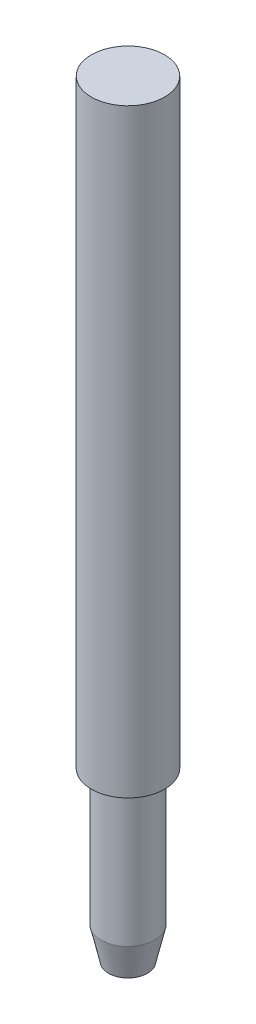
ISO-10303-21;
HEADER;
FILE_DESCRIPTION(('STEP AP214'),'2;1');
FILE_NAME('part.step','',(''),(''),'','','');
FILE_SCHEMA(('AUTOMOTIVE_DESIGN { 1 0 10303 214 1 1 1 1 }'));
ENDSEC;
DATA;
#1=APPLICATION_CONTEXT('core data for automotive mechanical design processes');
#2=APPLICATION_PROTOCOL_DEFINITION('international standard','automotive_design',2000,#1);
#3=PRODUCT_CONTEXT('',#1,'mechanical');
#4=PRODUCT('Part','Part','',(#3));
#5=PRODUCT_RELATED_PRODUCT_CATEGORY('part','',(#4));
#6=PRODUCT_DEFINITION_FORMATION('','',#4);
#7=PRODUCT_DEFINITION_CONTEXT('part definition',#1,'design');
#8=PRODUCT_DEFINITION('design','',#6,#7);
#9=PRODUCT_DEFINITION_SHAPE('','',#8);
#10=(LENGTH_UNIT() NAMED_UNIT(*) SI_UNIT(.MILLI.,.METRE.));
#11=(NAMED_UNIT(*) PLANE_ANGLE_UNIT() SI_UNIT($,.RADIAN.));
#12=(NAMED_UNIT(*) SI_UNIT($,.STERADIAN.) SOLID_ANGLE_UNIT());
#13=UNCERTAINTY_MEASURE_WITH_UNIT(LENGTH_MEASURE(1.E-05),#10,'distance_accuracy_value','');
#14=(GEOMETRIC_REPRESENTATION_CONTEXT(3) GLOBAL_UNCERTAINTY_ASSIGNED_CONTEXT((#13)) GLOBAL_UNIT_ASSIGNED_CONTEXT((#10,
#11,#12)) REPRESENTATION_CONTEXT('',''));
#15=CARTESIAN_POINT('',(0.,0.,0.));
#16=DIRECTION('',(0.,0.,1.));
#17=DIRECTION('',(1.,0.,0.));
#18=AXIS2_PLACEMENT_3D('',#15,#16,#17);
#19=CARTESIAN_POINT('',(0.,38.9763,0.));
#20=DIRECTION('',(0.,-1.,0.));
#21=DIRECTION('',(0.,0.,-1.));
#22=AXIS2_PLACEMENT_3D('',#19,#20,#21);
#23=CYLINDRICAL_SURFACE('',#22,2.38125);
#24=CARTESIAN_POINT('',(0.,38.9763,0.));
#25=DIRECTION('',(0.,1.,0.));
#26=DIRECTION('',(0.,0.,1.));
#27=AXIS2_PLACEMENT_3D('',#24,#25,#26);
#28=CIRCLE('',#27,2.38125);
#29=CARTESIAN_POINT('',(0.,38.9763,2.38125));
#30=VERTEX_POINT('',#29);
#31=EDGE_CURVE('E50',#30,#30,#28,.T.);
#32=ORIENTED_EDGE('',*,*,#31,.F.);
#33=EDGE_LOOP('',(#32));
#34=FACE_BOUND('',#33,.T.);
#35=CARTESIAN_POINT('',(0.,0.,0.));
#36=DIRECTION('',(0.,1.,0.));
#37=DIRECTION('',(0.,0.,1.));
#38=AXIS2_PLACEMENT_3D('',#35,#36,#37);
#39=CIRCLE('',#38,2.38125);
#40=CARTESIAN_POINT('',(0.,0.,2.38125));
#41=VERTEX_POINT('',#40);
#42=EDGE_CURVE('E45',#41,#41,#39,.T.);
#43=ORIENTED_EDGE('',*,*,#42,.T.);
#44=EDGE_LOOP('',(#43));
#45=FACE_BOUND('',#44,.T.);
#46=ADVANCED_FACE('F42',(#34,#45),#23,.T.);
#47=CARTESIAN_POINT('',(0.,38.9763,0.));
#48=DIRECTION('',(0.,1.,0.));
#49=DIRECTION('',(0.,0.,1.));
#50=AXIS2_PLACEMENT_3D('',#47,#48,#49);
#51=PLANE('',#50);
#52=ORIENTED_EDGE('',*,*,#31,.T.);
#53=EDGE_LOOP('',(#52));
#54=FACE_BOUND('',#53,.T.);
#55=ADVANCED_FACE('F79',(#54),#51,.T.);
#56=CARTESIAN_POINT('',(0.,0.,0.));
#57=DIRECTION('',(0.,1.,0.));
#58=DIRECTION('',(0.,0.,1.));
#59=AXIS2_PLACEMENT_3D('',#56,#57,#58);
#60=PLANE('',#59);
#61=CARTESIAN_POINT('',(0.,0.,0.));
#62=DIRECTION('',(0.,-1.,0.));
#63=DIRECTION('',(0.,0.,-1.));
#64=AXIS2_PLACEMENT_3D('',#61,#62,#63);
#65=CIRCLE('',#64,1.7526);
#66=CARTESIAN_POINT('',(0.,0.,-1.7526));
#67=VERTEX_POINT('',#66);
#68=EDGE_CURVE('E10',#67,#67,#65,.T.);
#69=ORIENTED_EDGE('',*,*,#68,.F.);
#70=EDGE_LOOP('',(#69));
#71=FACE_BOUND('',#70,.T.);
#72=ORIENTED_EDGE('',*,*,#42,.F.);
#73=EDGE_LOOP('',(#72));
#74=FACE_BOUND('',#73,.T.);
#75=ADVANCED_FACE('F84',(#71,#74),#60,.F.);
#76=CARTESIAN_POINT('',(0.,-10.922,0.));
#77=DIRECTION('',(0.,1.,0.));
#78=DIRECTION('',(0.,0.,1.));
#79=AXIS2_PLACEMENT_3D('',#76,#77,#78);
#80=CYLINDRICAL_SURFACE('',#79,1.7526);
#81=CARTESIAN_POINT('',(0.,-8.80533333333333,0.));
#82=DIRECTION('',(0.,1.,0.));
#83=DIRECTION('',(0.,0.,1.));
#84=AXIS2_PLACEMENT_3D('',#81,#82,#83);
#85=CIRCLE('',#84,1.7526);
#86=CARTESIAN_POINT('',(0.,-8.80533333333333,1.7526));
#87=VERTEX_POINT('',#86);
#88=EDGE_CURVE('E57',#87,#87,#85,.T.);
#89=ORIENTED_EDGE('',*,*,#88,.T.);
#90=EDGE_LOOP('',(#89));
#91=FACE_BOUND('',#90,.T.);
#92=ORIENTED_EDGE('',*,*,#68,.T.);
#93=EDGE_LOOP('',(#92));
#94=FACE_BOUND('',#93,.T.);
#95=ADVANCED_FACE('F74',(#91,#94),#80,.T.);
#96=CARTESIAN_POINT('',(0.,-10.922,0.));
#97=DIRECTION('',(0.,1.,0.));
#98=DIRECTION('',(0.,0.,1.));
#99=AXIS2_PLACEMENT_3D('',#96,#97,#98);
#100=CONICAL_SURFACE('',#99,1.27,0.224168044418514);
#101=ORIENTED_EDGE('',*,*,#88,.F.);
#102=EDGE_LOOP('',(#101));
#103=FACE_BOUND('',#102,.T.);
#104=CARTESIAN_POINT('',(0.,-10.922,0.));
#105=DIRECTION('',(0.,1.,0.));
#106=DIRECTION('',(0.,0.,1.));
#107=AXIS2_PLACEMENT_3D('',#104,#105,#106);
#108=CIRCLE('',#107,1.27);
#109=CARTESIAN_POINT('',(0.,-10.922,1.27));
#110=VERTEX_POINT('',#109);
#111=EDGE_CURVE('E61',#110,#110,#108,.T.);
#112=ORIENTED_EDGE('',*,*,#111,.T.);
#113=EDGE_LOOP('',(#112));
#114=FACE_BOUND('',#113,.T.);
#115=ADVANCED_FACE('F66',(#103,#114),#100,.T.);
#116=CARTESIAN_POINT('',(0.,-10.922,0.));
#117=DIRECTION('',(0.,-1.,0.));
#118=DIRECTION('',(0.,0.,-1.));
#119=AXIS2_PLACEMENT_3D('',#116,#117,#118);
#120=PLANE('',#119);
#121=ORIENTED_EDGE('',*,*,#111,.F.);
#122=EDGE_LOOP('',(#121));
#123=FACE_BOUND('',#122,.T.);
#124=ADVANCED_FACE('F68',(#123),#120,.T.);
#125=CLOSED_SHELL('',(#46,#55,#75,#95,#115,#124));
#126=MANIFOLD_SOLID_BREP('B2',#125);
#127=ADVANCED_BREP_SHAPE_REPRESENTATION('',(#18,#126),#14);
#128=SHAPE_DEFINITION_REPRESENTATION(#9,#127);
ENDSEC;
END-ISO-10303-21;
